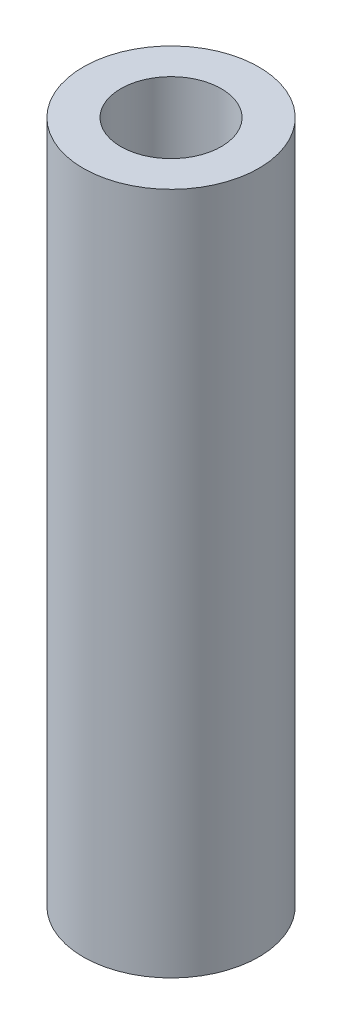
ISO-10303-21;
HEADER;
FILE_DESCRIPTION(('STEP AP214'),'2;1');
FILE_NAME('part.step','',(''),(''),'','','');
FILE_SCHEMA(('AUTOMOTIVE_DESIGN { 1 0 10303 214 1 1 1 1 }'));
ENDSEC;
DATA;
#1=APPLICATION_CONTEXT('core data for automotive mechanical design processes');
#2=APPLICATION_PROTOCOL_DEFINITION('international standard','automotive_design',2000,#1);
#3=PRODUCT_CONTEXT('',#1,'mechanical');
#4=PRODUCT('Part','Part','',(#3));
#5=PRODUCT_RELATED_PRODUCT_CATEGORY('part','',(#4));
#6=PRODUCT_DEFINITION_FORMATION('','',#4);
#7=PRODUCT_DEFINITION_CONTEXT('part definition',#1,'design');
#8=PRODUCT_DEFINITION('design','',#6,#7);
#9=PRODUCT_DEFINITION_SHAPE('','',#8);
#10=(LENGTH_UNIT() NAMED_UNIT(*) SI_UNIT(.MILLI.,.METRE.));
#11=(NAMED_UNIT(*) PLANE_ANGLE_UNIT() SI_UNIT($,.RADIAN.));
#12=(NAMED_UNIT(*) SI_UNIT($,.STERADIAN.) SOLID_ANGLE_UNIT());
#13=UNCERTAINTY_MEASURE_WITH_UNIT(LENGTH_MEASURE(1.E-05),#10,'distance_accuracy_value','');
#14=(GEOMETRIC_REPRESENTATION_CONTEXT(3) GLOBAL_UNCERTAINTY_ASSIGNED_CONTEXT((#13)) GLOBAL_UNIT_ASSIGNED_CONTEXT((#10,
#11,#12)) REPRESENTATION_CONTEXT('',''));
#15=CARTESIAN_POINT('',(0.,0.,0.));
#16=DIRECTION('',(0.,0.,1.));
#17=DIRECTION('',(1.,0.,0.));
#18=AXIS2_PLACEMENT_3D('',#15,#16,#17);
#19=CARTESIAN_POINT('',(0.,35.,0.));
#20=DIRECTION('',(0.,1.,0.));
#21=DIRECTION('',(0.,0.,1.));
#22=AXIS2_PLACEMENT_3D('',#19,#20,#21);
#23=PLANE('',#22);
#24=CARTESIAN_POINT('',(0.,35.,0.));
#25=DIRECTION('',(0.,1.,0.));
#26=DIRECTION('',(0.,0.,1.));
#27=AXIS2_PLACEMENT_3D('',#24,#25,#26);
#28=CIRCLE('',#27,4.5);
#29=CARTESIAN_POINT('',(0.,35.,4.5));
#30=VERTEX_POINT('',#29);
#31=EDGE_CURVE('E10',#30,#30,#28,.T.);
#32=ORIENTED_EDGE('',*,*,#31,.T.);
#33=EDGE_LOOP('',(#32));
#34=FACE_BOUND('',#33,.T.);
#35=CARTESIAN_POINT('',(0.,35.,0.));
#36=DIRECTION('',(0.,1.,0.));
#37=DIRECTION('',(0.,0.,1.));
#38=AXIS2_PLACEMENT_3D('',#35,#36,#37);
#39=CIRCLE('',#38,2.575);
#40=CARTESIAN_POINT('',(0.,35.,2.575));
#41=VERTEX_POINT('',#40);
#42=EDGE_CURVE('E56',#41,#41,#39,.T.);
#43=ORIENTED_EDGE('',*,*,#42,.F.);
#44=EDGE_LOOP('',(#43));
#45=FACE_BOUND('',#44,.T.);
#46=ADVANCED_FACE('F43',(#34,#45),#23,.T.);
#47=CARTESIAN_POINT('',(0.,0.,0.));
#48=DIRECTION('',(0.,1.,0.));
#49=DIRECTION('',(0.,0.,1.));
#50=AXIS2_PLACEMENT_3D('',#47,#48,#49);
#51=PLANE('',#50);
#52=CARTESIAN_POINT('',(0.,0.,0.));
#53=DIRECTION('',(0.,1.,0.));
#54=DIRECTION('',(0.,0.,1.));
#55=AXIS2_PLACEMENT_3D('',#52,#53,#54);
#56=CIRCLE('',#55,4.5);
#57=CARTESIAN_POINT('',(0.,0.,4.5));
#58=VERTEX_POINT('',#57);
#59=EDGE_CURVE('E47',#58,#58,#56,.T.);
#60=ORIENTED_EDGE('',*,*,#59,.F.);
#61=EDGE_LOOP('',(#60));
#62=FACE_BOUND('',#61,.T.);
#63=CARTESIAN_POINT('',(0.,0.,0.));
#64=DIRECTION('',(0.,1.,0.));
#65=DIRECTION('',(0.,0.,1.));
#66=AXIS2_PLACEMENT_3D('',#63,#64,#65);
#67=CIRCLE('',#66,2.575);
#68=CARTESIAN_POINT('',(0.,0.,2.575));
#69=VERTEX_POINT('',#68);
#70=EDGE_CURVE('E58',#69,#69,#67,.T.);
#71=ORIENTED_EDGE('',*,*,#70,.T.);
#72=EDGE_LOOP('',(#71));
#73=FACE_BOUND('',#72,.T.);
#74=ADVANCED_FACE('F70',(#62,#73),#51,.F.);
#75=CARTESIAN_POINT('',(0.,35.,0.));
#76=DIRECTION('',(0.,-1.,0.));
#77=DIRECTION('',(0.,0.,-1.));
#78=AXIS2_PLACEMENT_3D('',#75,#76,#77);
#79=CYLINDRICAL_SURFACE('',#78,4.5);
#80=ORIENTED_EDGE('',*,*,#31,.F.);
#81=EDGE_LOOP('',(#80));
#82=FACE_BOUND('',#81,.T.);
#83=ORIENTED_EDGE('',*,*,#59,.T.);
#84=EDGE_LOOP('',(#83));
#85=FACE_BOUND('',#84,.T.);
#86=ADVANCED_FACE('F45',(#82,#85),#79,.T.);
#87=CARTESIAN_POINT('',(0.,35.,0.));
#88=DIRECTION('',(0.,-1.,0.));
#89=DIRECTION('',(0.,0.,-1.));
#90=AXIS2_PLACEMENT_3D('',#87,#88,#89);
#91=CYLINDRICAL_SURFACE('',#90,2.575);
#92=ORIENTED_EDGE('',*,*,#42,.T.);
#93=EDGE_LOOP('',(#92));
#94=FACE_BOUND('',#93,.T.);
#95=ORIENTED_EDGE('',*,*,#70,.F.);
#96=EDGE_LOOP('',(#95));
#97=FACE_BOUND('',#96,.T.);
#98=ADVANCED_FACE('F66',(#94,#97),#91,.F.);
#99=CLOSED_SHELL('',(#46,#74,#86,#98));
#100=MANIFOLD_SOLID_BREP('B2',#99);
#101=ADVANCED_BREP_SHAPE_REPRESENTATION('',(#18,#100),#14);
#102=SHAPE_DEFINITION_REPRESENTATION(#9,#101);
ENDSEC;
END-ISO-10303-21;
